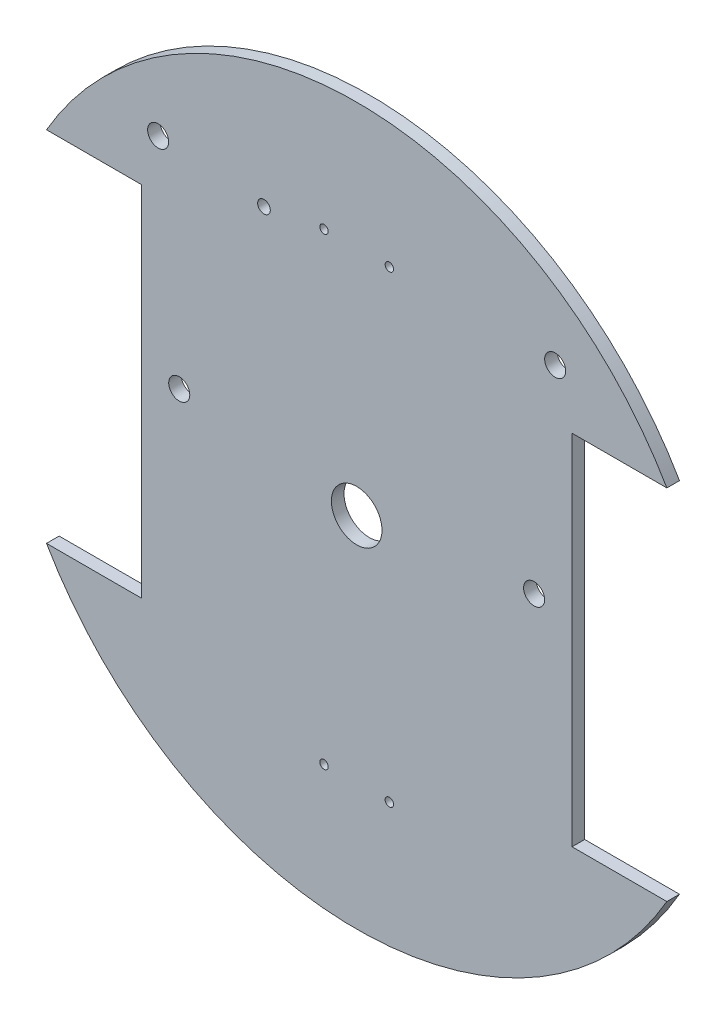
ISO-10303-21;
HEADER;
FILE_DESCRIPTION(('STEP AP214'),'2;1');
FILE_NAME('part.step','',(''),(''),'','','');
FILE_SCHEMA(('AUTOMOTIVE_DESIGN { 1 0 10303 214 1 1 1 1 }'));
ENDSEC;
DATA;
#1=APPLICATION_CONTEXT('core data for automotive mechanical design processes');
#2=APPLICATION_PROTOCOL_DEFINITION('international standard','automotive_design',2000,#1);
#3=PRODUCT_CONTEXT('',#1,'mechanical');
#4=PRODUCT('Part','Part','',(#3));
#5=PRODUCT_RELATED_PRODUCT_CATEGORY('part','',(#4));
#6=PRODUCT_DEFINITION_FORMATION('','',#4);
#7=PRODUCT_DEFINITION_CONTEXT('part definition',#1,'design');
#8=PRODUCT_DEFINITION('design','',#6,#7);
#9=PRODUCT_DEFINITION_SHAPE('','',#8);
#10=(LENGTH_UNIT() NAMED_UNIT(*) SI_UNIT(.MILLI.,.METRE.));
#11=(NAMED_UNIT(*) PLANE_ANGLE_UNIT() SI_UNIT($,.RADIAN.));
#12=(NAMED_UNIT(*) SI_UNIT($,.STERADIAN.) SOLID_ANGLE_UNIT());
#13=UNCERTAINTY_MEASURE_WITH_UNIT(LENGTH_MEASURE(1.E-05),#10,'distance_accuracy_value','');
#14=(GEOMETRIC_REPRESENTATION_CONTEXT(3) GLOBAL_UNCERTAINTY_ASSIGNED_CONTEXT((#13)) GLOBAL_UNIT_ASSIGNED_CONTEXT((#10,
#11,#12)) REPRESENTATION_CONTEXT('',''));
#15=CARTESIAN_POINT('',(0.,0.,0.));
#16=DIRECTION('',(0.,0.,1.));
#17=DIRECTION('',(1.,0.,0.));
#18=AXIS2_PLACEMENT_3D('',#15,#16,#17);
#19=CARTESIAN_POINT('',(-147.959743570363,62.548931244192,3.));
#20=DIRECTION('',(0.,0.,1.));
#21=DIRECTION('',(1.,0.,0.));
#22=AXIS2_PLACEMENT_3D('',#19,#20,#21);
#23=PLANE('',#22);
#24=CARTESIAN_POINT('',(-147.959743570363,62.548931244192,3.));
#25=DIRECTION('',(0.,0.,1.));
#26=DIRECTION('',(1.,0.,0.));
#27=AXIS2_PLACEMENT_3D('',#24,#25,#26);
#28=CIRCLE('',#27,6.00000000000002);
#29=CARTESIAN_POINT('',(-141.959743570363,62.548931244192,3.));
#30=VERTEX_POINT('',#29);
#31=EDGE_CURVE('E356',#30,#30,#28,.T.);
#32=ORIENTED_EDGE('',*,*,#31,.F.);
#33=EDGE_LOOP('',(#32));
#34=FACE_BOUND('',#33,.T.);
#35=CARTESIAN_POINT('',(-169.959743570363,115.048931244192,3.));
#36=DIRECTION('',(0.,0.,1.));
#37=DIRECTION('',(1.,0.,0.));
#38=AXIS2_PLACEMENT_3D('',#35,#36,#37);
#39=CIRCLE('',#38,1.5);
#40=CARTESIAN_POINT('',(-168.459743570363,115.048931244192,3.));
#41=VERTEX_POINT('',#40);
#42=EDGE_CURVE('E366',#41,#41,#39,.T.);
#43=ORIENTED_EDGE('',*,*,#42,.F.);
#44=EDGE_LOOP('',(#43));
#45=FACE_BOUND('',#44,.T.);
#46=CARTESIAN_POINT('',(-195.07190289204,117.048931244192,3.));
#47=DIRECTION('',(0.,0.,1.));
#48=DIRECTION('',(1.,0.,0.));
#49=AXIS2_PLACEMENT_3D('',#46,#47,#48);
#50=CIRCLE('',#49,2.5);
#51=CARTESIAN_POINT('',(-192.57190289204,117.048931244192,3.));
#52=VERTEX_POINT('',#51);
#53=EDGE_CURVE('E378',#52,#52,#50,.T.);
#54=ORIENTED_EDGE('',*,*,#53,.F.);
#55=EDGE_LOOP('',(#54));
#56=FACE_BOUND('',#55,.T.);
#57=CARTESIAN_POINT('',(-100.847584248685,117.048931244192,3.));
#58=DIRECTION('',(0.,0.,1.));
#59=DIRECTION('',(1.,0.,0.));
#60=AXIS2_PLACEMENT_3D('',#57,#58,#59);
#61=CIRCLE('',#60,2.50000000000001);
#62=CARTESIAN_POINT('',(-98.3475842486854,117.048931244192,3.));
#63=VERTEX_POINT('',#62);
#64=EDGE_CURVE('E373',#63,#63,#61,.T.);
#65=ORIENTED_EDGE('',*,*,#64,.F.);
#66=EDGE_LOOP('',(#65));
#67=FACE_BOUND('',#66,.T.);
#68=CARTESIAN_POINT('',(-190.07190289204,67.548931244192,3.));
#69=DIRECTION('',(0.,0.,1.));
#70=DIRECTION('',(1.,0.,0.));
#71=AXIS2_PLACEMENT_3D('',#68,#69,#70);
#72=CIRCLE('',#71,2.5);
#73=CARTESIAN_POINT('',(-187.57190289204,67.548931244192,3.));
#74=VERTEX_POINT('',#73);
#75=EDGE_CURVE('E390',#74,#74,#72,.T.);
#76=ORIENTED_EDGE('',*,*,#75,.F.);
#77=EDGE_LOOP('',(#76));
#78=FACE_BOUND('',#77,.T.);
#79=CARTESIAN_POINT('',(-105.847584248685,67.548931244192,3.));
#80=DIRECTION('',(0.,0.,1.));
#81=DIRECTION('',(1.,0.,0.));
#82=AXIS2_PLACEMENT_3D('',#79,#80,#81);
#83=CIRCLE('',#82,2.50000000000001);
#84=CARTESIAN_POINT('',(-103.347584248685,67.548931244192,3.));
#85=VERTEX_POINT('',#84);
#86=EDGE_CURVE('E385',#85,#85,#83,.T.);
#87=ORIENTED_EDGE('',*,*,#86,.F.);
#88=EDGE_LOOP('',(#87));
#89=FACE_BOUND('',#88,.T.);
#90=CARTESIAN_POINT('',(-155.709743570363,7.54893124419204,3.));
#91=DIRECTION('',(0.,0.,-1.));
#92=DIRECTION('',(-1.,0.,0.));
#93=AXIS2_PLACEMENT_3D('',#90,#91,#92);
#94=CIRCLE('',#93,0.999999999999998);
#95=CARTESIAN_POINT('',(-156.709743570363,7.54893124419204,3.));
#96=VERTEX_POINT('',#95);
#97=EDGE_CURVE('E396',#96,#96,#94,.T.);
#98=ORIENTED_EDGE('',*,*,#97,.T.);
#99=EDGE_LOOP('',(#98));
#100=FACE_BOUND('',#99,.T.);
#101=CARTESIAN_POINT('',(-140.209743570363,7.54893124419204,3.));
#102=DIRECTION('',(0.,0.,1.));
#103=DIRECTION('',(1.,0.,0.));
#104=AXIS2_PLACEMENT_3D('',#101,#102,#103);
#105=CIRCLE('',#104,0.999999999999998);
#106=CARTESIAN_POINT('',(-139.209743570363,7.54893124419204,3.));
#107=VERTEX_POINT('',#106);
#108=EDGE_CURVE('E393',#107,#107,#105,.T.);
#109=ORIENTED_EDGE('',*,*,#108,.F.);
#110=EDGE_LOOP('',(#109));
#111=FACE_BOUND('',#110,.T.);
#112=CARTESIAN_POINT('',(-155.709743570363,117.548931244192,3.));
#113=DIRECTION('',(0.,0.,1.));
#114=DIRECTION('',(1.,0.,0.));
#115=AXIS2_PLACEMENT_3D('',#112,#113,#114);
#116=CIRCLE('',#115,0.999999999999998);
#117=CARTESIAN_POINT('',(-154.709743570363,117.548931244192,3.));
#118=VERTEX_POINT('',#117);
#119=EDGE_CURVE('E137',#118,#118,#116,.T.);
#120=ORIENTED_EDGE('',*,*,#119,.F.);
#121=EDGE_LOOP('',(#120));
#122=FACE_BOUND('',#121,.T.);
#123=DIRECTION('',(0.,1.,0.));
#124=VECTOR('',#123,1.);
#125=CARTESIAN_POINT('',(-199.07190289204,62.548931244192,3.));
#126=LINE('',#125,#124);
#127=CARTESIAN_POINT('',(-199.07190289204,20.048931244192,3.));
#128=VERTEX_POINT('',#127);
#129=CARTESIAN_POINT('',(-199.07190289204,105.048931244192,3.));
#130=VERTEX_POINT('',#129);
#131=EDGE_CURVE('E110',#128,#130,#126,.T.);
#132=ORIENTED_EDGE('',*,*,#131,.F.);
#133=DIRECTION('',(-1.,0.,0.));
#134=VECTOR('',#133,1.);
#135=CARTESIAN_POINT('',(-147.959743570363,20.048931244192,3.));
#136=LINE('',#135,#134);
#137=CARTESIAN_POINT('',(-221.57190289204,20.048931244192,3.));
#138=VERTEX_POINT('',#137);
#139=EDGE_CURVE('E162',#128,#138,#136,.T.);
#140=ORIENTED_EDGE('',*,*,#139,.T.);
#141=CARTESIAN_POINT('',(-147.959743570363,62.548931244192,3.));
#142=DIRECTION('',(0.,0.,1.));
#143=DIRECTION('',(1.,0.,0.));
#144=AXIS2_PLACEMENT_3D('',#141,#142,#143);
#145=CIRCLE('',#144,85.);
#146=CARTESIAN_POINT('',(-74.3475842486854,20.048931244192,3.));
#147=VERTEX_POINT('',#146);
#148=EDGE_CURVE('E42',#138,#147,#145,.T.);
#149=ORIENTED_EDGE('',*,*,#148,.T.);
#150=DIRECTION('',(1.,0.,0.));
#151=VECTOR('',#150,1.);
#152=CARTESIAN_POINT('',(-147.959743570363,20.0489312441919,3.));
#153=LINE('',#152,#151);
#154=CARTESIAN_POINT('',(-96.8475842486854,20.048931244192,3.));
#155=VERTEX_POINT('',#154);
#156=EDGE_CURVE('E144',#155,#147,#153,.T.);
#157=ORIENTED_EDGE('',*,*,#156,.F.);
#158=DIRECTION('',(0.,1.,0.));
#159=VECTOR('',#158,1.);
#160=CARTESIAN_POINT('',(-96.8475842486854,62.548931244192,3.));
#161=LINE('',#160,#159);
#162=CARTESIAN_POINT('',(-96.8475842486854,105.048931244192,3.));
#163=VERTEX_POINT('',#162);
#164=EDGE_CURVE('E152',#155,#163,#161,.T.);
#165=ORIENTED_EDGE('',*,*,#164,.T.);
#166=DIRECTION('',(1.,0.,0.));
#167=VECTOR('',#166,1.);
#168=CARTESIAN_POINT('',(-147.959743570363,105.048931244192,3.));
#169=LINE('',#168,#167);
#170=CARTESIAN_POINT('',(-74.3475842486854,105.048931244192,3.));
#171=VERTEX_POINT('',#170);
#172=EDGE_CURVE('E147',#163,#171,#169,.T.);
#173=ORIENTED_EDGE('',*,*,#172,.T.);
#174=CARTESIAN_POINT('',(-221.57190289204,105.048931244192,3.));
#175=VERTEX_POINT('',#174);
#176=EDGE_CURVE('E11',#171,#175,#145,.T.);
#177=ORIENTED_EDGE('',*,*,#176,.T.);
#178=DIRECTION('',(-1.,0.,0.));
#179=VECTOR('',#178,1.);
#180=CARTESIAN_POINT('',(-147.959743570363,105.048931244192,3.));
#181=LINE('',#180,#179);
#182=EDGE_CURVE('E191',#130,#175,#181,.T.);
#183=ORIENTED_EDGE('',*,*,#182,.F.);
#184=EDGE_LOOP('',(#132,#140,#149,#157,#165,#173,#177,#183));
#185=FACE_BOUND('',#184,.T.);
#186=CARTESIAN_POINT('',(-140.209743570363,117.548931244192,3.));
#187=DIRECTION('',(0.,0.,-1.));
#188=DIRECTION('',(-1.,0.,0.));
#189=AXIS2_PLACEMENT_3D('',#186,#187,#188);
#190=CIRCLE('',#189,0.999999999999998);
#191=CARTESIAN_POINT('',(-141.209743570363,117.548931244192,3.));
#192=VERTEX_POINT('',#191);
#193=EDGE_CURVE('E397',#192,#192,#190,.T.);
#194=ORIENTED_EDGE('',*,*,#193,.T.);
#195=EDGE_LOOP('',(#194));
#196=FACE_BOUND('',#195,.T.);
#197=ADVANCED_FACE('F33',(#34,#45,#56,#67,#78,#89,#100,#111,#122,#185,#196),#23,.T.);
#198=CARTESIAN_POINT('',(-147.959743570363,62.548931244192,0.));
#199=DIRECTION('',(0.,0.,1.));
#200=DIRECTION('',(1.,0.,0.));
#201=AXIS2_PLACEMENT_3D('',#198,#199,#200);
#202=PLANE('',#201);
#203=CARTESIAN_POINT('',(-147.959743570363,62.548931244192,0.));
#204=DIRECTION('',(0.,0.,-1.));
#205=DIRECTION('',(-1.,0.,0.));
#206=AXIS2_PLACEMENT_3D('',#203,#204,#205);
#207=CIRCLE('',#206,6.00000000000002);
#208=CARTESIAN_POINT('',(-153.959743570363,62.548931244192,0.));
#209=VERTEX_POINT('',#208);
#210=EDGE_CURVE('E359',#209,#209,#207,.T.);
#211=ORIENTED_EDGE('',*,*,#210,.F.);
#212=EDGE_LOOP('',(#211));
#213=FACE_BOUND('',#212,.T.);
#214=CARTESIAN_POINT('',(-169.959743570363,115.048931244192,0.));
#215=DIRECTION('',(0.,0.,-1.));
#216=DIRECTION('',(-1.,0.,0.));
#217=AXIS2_PLACEMENT_3D('',#214,#215,#216);
#218=CIRCLE('',#217,1.5);
#219=CARTESIAN_POINT('',(-171.459743570363,115.048931244192,0.));
#220=VERTEX_POINT('',#219);
#221=EDGE_CURVE('E361',#220,#220,#218,.T.);
#222=ORIENTED_EDGE('',*,*,#221,.F.);
#223=EDGE_LOOP('',(#222));
#224=FACE_BOUND('',#223,.T.);
#225=CARTESIAN_POINT('',(-195.07190289204,117.048931244192,0.));
#226=DIRECTION('',(0.,0.,-1.));
#227=DIRECTION('',(-1.,0.,0.));
#228=AXIS2_PLACEMENT_3D('',#225,#226,#227);
#229=CIRCLE('',#228,2.5);
#230=CARTESIAN_POINT('',(-197.57190289204,117.048931244192,0.));
#231=VERTEX_POINT('',#230);
#232=EDGE_CURVE('E370',#231,#231,#229,.T.);
#233=ORIENTED_EDGE('',*,*,#232,.F.);
#234=EDGE_LOOP('',(#233));
#235=FACE_BOUND('',#234,.T.);
#236=CARTESIAN_POINT('',(-100.847584248685,117.048931244192,0.));
#237=DIRECTION('',(0.,0.,-1.));
#238=DIRECTION('',(1.,0.,0.));
#239=AXIS2_PLACEMENT_3D('',#236,#237,#238);
#240=CIRCLE('',#239,2.50000000000001);
#241=CARTESIAN_POINT('',(-98.3475842486854,117.048931244192,0.));
#242=VERTEX_POINT('',#241);
#243=EDGE_CURVE('E369',#242,#242,#240,.T.);
#244=ORIENTED_EDGE('',*,*,#243,.F.);
#245=EDGE_LOOP('',(#244));
#246=FACE_BOUND('',#245,.T.);
#247=CARTESIAN_POINT('',(-190.07190289204,67.548931244192,0.));
#248=DIRECTION('',(0.,0.,-1.));
#249=DIRECTION('',(-1.,0.,0.));
#250=AXIS2_PLACEMENT_3D('',#247,#248,#249);
#251=CIRCLE('',#250,2.5);
#252=CARTESIAN_POINT('',(-192.57190289204,67.548931244192,0.));
#253=VERTEX_POINT('',#252);
#254=EDGE_CURVE('E382',#253,#253,#251,.T.);
#255=ORIENTED_EDGE('',*,*,#254,.F.);
#256=EDGE_LOOP('',(#255));
#257=FACE_BOUND('',#256,.T.);
#258=CARTESIAN_POINT('',(-105.847584248685,67.548931244192,0.));
#259=DIRECTION('',(0.,0.,-1.));
#260=DIRECTION('',(-1.,0.,0.));
#261=AXIS2_PLACEMENT_3D('',#258,#259,#260);
#262=CIRCLE('',#261,2.50000000000001);
#263=CARTESIAN_POINT('',(-108.347584248685,67.548931244192,0.));
#264=VERTEX_POINT('',#263);
#265=EDGE_CURVE('E381',#264,#264,#262,.T.);
#266=ORIENTED_EDGE('',*,*,#265,.F.);
#267=EDGE_LOOP('',(#266));
#268=FACE_BOUND('',#267,.T.);
#269=CARTESIAN_POINT('',(-140.209743570363,7.54893124419204,0.));
#270=DIRECTION('',(0.,0.,1.));
#271=DIRECTION('',(1.,0.,0.));
#272=AXIS2_PLACEMENT_3D('',#269,#270,#271);
#273=CIRCLE('',#272,0.999999999999998);
#274=CARTESIAN_POINT('',(-139.209743570363,7.54893124419204,0.));
#275=VERTEX_POINT('',#274);
#276=EDGE_CURVE('E136',#275,#275,#273,.T.);
#277=ORIENTED_EDGE('',*,*,#276,.T.);
#278=EDGE_LOOP('',(#277));
#279=FACE_BOUND('',#278,.T.);
#280=CARTESIAN_POINT('',(-155.709743570363,117.548931244192,0.));
#281=DIRECTION('',(0.,0.,1.));
#282=DIRECTION('',(1.,0.,0.));
#283=AXIS2_PLACEMENT_3D('',#280,#281,#282);
#284=CIRCLE('',#283,0.999999999999998);
#285=CARTESIAN_POINT('',(-154.709743570363,117.548931244192,0.));
#286=VERTEX_POINT('',#285);
#287=EDGE_CURVE('E133',#286,#286,#284,.T.);
#288=ORIENTED_EDGE('',*,*,#287,.T.);
#289=EDGE_LOOP('',(#288));
#290=FACE_BOUND('',#289,.T.);
#291=DIRECTION('',(-1.,0.,0.));
#292=VECTOR('',#291,1.);
#293=CARTESIAN_POINT('',(-147.959743570363,20.048931244192,0.));
#294=LINE('',#293,#292);
#295=CARTESIAN_POINT('',(-199.07190289204,20.048931244192,0.));
#296=VERTEX_POINT('',#295);
#297=CARTESIAN_POINT('',(-221.57190289204,20.048931244192,0.));
#298=VERTEX_POINT('',#297);
#299=EDGE_CURVE('E99',#296,#298,#294,.T.);
#300=ORIENTED_EDGE('',*,*,#299,.F.);
#301=DIRECTION('',(0.,1.,0.));
#302=VECTOR('',#301,1.);
#303=CARTESIAN_POINT('',(-199.07190289204,62.548931244192,0.));
#304=LINE('',#303,#302);
#305=CARTESIAN_POINT('',(-199.07190289204,105.048931244192,0.));
#306=VERTEX_POINT('',#305);
#307=EDGE_CURVE('E185',#296,#306,#304,.T.);
#308=ORIENTED_EDGE('',*,*,#307,.T.);
#309=DIRECTION('',(-1.,0.,0.));
#310=VECTOR('',#309,1.);
#311=CARTESIAN_POINT('',(-147.959743570363,105.048931244192,0.));
#312=LINE('',#311,#310);
#313=CARTESIAN_POINT('',(-221.57190289204,105.048931244192,0.));
#314=VERTEX_POINT('',#313);
#315=EDGE_CURVE('E50',#306,#314,#312,.T.);
#316=ORIENTED_EDGE('',*,*,#315,.T.);
#317=CARTESIAN_POINT('',(-147.959743570363,62.548931244192,0.));
#318=DIRECTION('',(0.,0.,1.));
#319=DIRECTION('',(1.,0.,0.));
#320=AXIS2_PLACEMENT_3D('',#317,#318,#319);
#321=CIRCLE('',#320,85.);
#322=CARTESIAN_POINT('',(-74.3475842486854,105.048931244192,0.));
#323=VERTEX_POINT('',#322);
#324=EDGE_CURVE('E127',#323,#314,#321,.T.);
#325=ORIENTED_EDGE('',*,*,#324,.F.);
#326=DIRECTION('',(1.,0.,0.));
#327=VECTOR('',#326,1.);
#328=CARTESIAN_POINT('',(-147.959743570363,105.048931244192,0.));
#329=LINE('',#328,#327);
#330=CARTESIAN_POINT('',(-96.8475842486854,105.048931244192,0.));
#331=VERTEX_POINT('',#330);
#332=EDGE_CURVE('E167',#331,#323,#329,.T.);
#333=ORIENTED_EDGE('',*,*,#332,.F.);
#334=DIRECTION('',(0.,1.,0.));
#335=VECTOR('',#334,1.);
#336=CARTESIAN_POINT('',(-96.8475842486854,62.548931244192,0.));
#337=LINE('',#336,#335);
#338=CARTESIAN_POINT('',(-96.8475842486854,20.048931244192,0.));
#339=VERTEX_POINT('',#338);
#340=EDGE_CURVE('E155',#339,#331,#337,.T.);
#341=ORIENTED_EDGE('',*,*,#340,.F.);
#342=DIRECTION('',(1.,0.,0.));
#343=VECTOR('',#342,1.);
#344=CARTESIAN_POINT('',(-147.959743570363,20.0489312441919,0.));
#345=LINE('',#344,#343);
#346=CARTESIAN_POINT('',(-74.3475842486854,20.048931244192,0.));
#347=VERTEX_POINT('',#346);
#348=EDGE_CURVE('E126',#339,#347,#345,.T.);
#349=ORIENTED_EDGE('',*,*,#348,.T.);
#350=EDGE_CURVE('E116',#298,#347,#321,.T.);
#351=ORIENTED_EDGE('',*,*,#350,.F.);
#352=EDGE_LOOP('',(#300,#308,#316,#325,#333,#341,#349,#351));
#353=FACE_BOUND('',#352,.T.);
#354=CARTESIAN_POINT('',(-155.709743570363,7.54893124419204,0.));
#355=DIRECTION('',(0.,0.,1.));
#356=DIRECTION('',(1.,0.,0.));
#357=AXIS2_PLACEMENT_3D('',#354,#355,#356);
#358=CIRCLE('',#357,0.999999999999998);
#359=CARTESIAN_POINT('',(-154.709743570363,7.54893124419204,0.));
#360=VERTEX_POINT('',#359);
#361=EDGE_CURVE('E139',#360,#360,#358,.F.);
#362=ORIENTED_EDGE('',*,*,#361,.F.);
#363=EDGE_LOOP('',(#362));
#364=FACE_BOUND('',#363,.T.);
#365=CARTESIAN_POINT('',(-140.209743570363,117.548931244192,0.));
#366=DIRECTION('',(0.,0.,1.));
#367=DIRECTION('',(1.,0.,0.));
#368=AXIS2_PLACEMENT_3D('',#365,#366,#367);
#369=CIRCLE('',#368,0.999999999999998);
#370=CARTESIAN_POINT('',(-139.209743570363,117.548931244192,0.));
#371=VERTEX_POINT('',#370);
#372=EDGE_CURVE('E37',#371,#371,#369,.F.);
#373=ORIENTED_EDGE('',*,*,#372,.F.);
#374=EDGE_LOOP('',(#373));
#375=FACE_BOUND('',#374,.T.);
#376=ADVANCED_FACE('F122',(#213,#224,#235,#246,#257,#268,#279,#290,#353,#364,#375),#202,.F.);
#377=CARTESIAN_POINT('',(-147.959743570363,62.548931244192,3.));
#378=DIRECTION('',(0.,0.,-1.));
#379=DIRECTION('',(-1.,0.,0.));
#380=AXIS2_PLACEMENT_3D('',#377,#378,#379);
#381=CYLINDRICAL_SURFACE('',#380,85.);
#382=ORIENTED_EDGE('',*,*,#324,.T.);
#383=DIRECTION('',(0.,0.,1.));
#384=VECTOR('',#383,1.);
#385=CARTESIAN_POINT('',(-221.57190289204,105.048931244192,0.));
#386=LINE('',#385,#384);
#387=EDGE_CURVE('E119',#314,#175,#386,.T.);
#388=ORIENTED_EDGE('',*,*,#387,.T.);
#389=ORIENTED_EDGE('',*,*,#176,.F.);
#390=DIRECTION('',(0.,0.,-1.));
#391=VECTOR('',#390,1.);
#392=CARTESIAN_POINT('',(-74.3475842486854,105.048931244192,3.));
#393=LINE('',#392,#391);
#394=EDGE_CURVE('E118',#323,#171,#393,.F.);
#395=ORIENTED_EDGE('',*,*,#394,.F.);
#396=EDGE_LOOP('',(#382,#388,#389,#395));
#397=FACE_BOUND('',#396,.T.);
#398=ADVANCED_FACE('F177',(#397),#381,.T.);
#399=DIRECTION('',(0.,0.,1.));
#400=VECTOR('',#399,1.);
#401=CARTESIAN_POINT('',(-221.57190289204,20.048931244192,0.));
#402=LINE('',#401,#400);
#403=EDGE_CURVE('E103',#298,#138,#402,.T.);
#404=ORIENTED_EDGE('',*,*,#403,.F.);
#405=ORIENTED_EDGE('',*,*,#350,.T.);
#406=DIRECTION('',(0.,0.,-1.));
#407=VECTOR('',#406,1.);
#408=CARTESIAN_POINT('',(-74.3475842486854,20.048931244192,3.));
#409=LINE('',#408,#407);
#410=EDGE_CURVE('E128',#347,#147,#409,.F.);
#411=ORIENTED_EDGE('',*,*,#410,.T.);
#412=ORIENTED_EDGE('',*,*,#148,.F.);
#413=EDGE_LOOP('',(#404,#405,#411,#412));
#414=FACE_BOUND('',#413,.T.);
#415=ADVANCED_FACE('F35',(#414),#381,.T.);
#416=CARTESIAN_POINT('',(-147.959743570363,20.0489312441919,0.));
#417=DIRECTION('',(0.,-1.,0.));
#418=DIRECTION('',(1.,0.,0.));
#419=AXIS2_PLACEMENT_3D('',#416,#417,#418);
#420=PLANE('',#419);
#421=ORIENTED_EDGE('',*,*,#348,.F.);
#422=DIRECTION('',(0.,0.,1.));
#423=VECTOR('',#422,1.);
#424=CARTESIAN_POINT('',(-96.8475842486854,20.048931244192,0.));
#425=LINE('',#424,#423);
#426=EDGE_CURVE('E160',#339,#155,#425,.T.);
#427=ORIENTED_EDGE('',*,*,#426,.T.);
#428=ORIENTED_EDGE('',*,*,#156,.T.);
#429=ORIENTED_EDGE('',*,*,#410,.F.);
#430=EDGE_LOOP('',(#421,#427,#428,#429));
#431=FACE_BOUND('',#430,.T.);
#432=ADVANCED_FACE('F216',(#431),#420,.F.);
#433=CARTESIAN_POINT('',(-147.959743570363,105.048931244192,0.));
#434=DIRECTION('',(0.,-1.,0.));
#435=DIRECTION('',(0.,0.,-1.));
#436=AXIS2_PLACEMENT_3D('',#433,#434,#435);
#437=PLANE('',#436);
#438=ORIENTED_EDGE('',*,*,#394,.T.);
#439=ORIENTED_EDGE('',*,*,#172,.F.);
#440=DIRECTION('',(0.,0.,1.));
#441=VECTOR('',#440,1.);
#442=CARTESIAN_POINT('',(-96.8475842486854,105.048931244192,0.));
#443=LINE('',#442,#441);
#444=EDGE_CURVE('E58',#331,#163,#443,.T.);
#445=ORIENTED_EDGE('',*,*,#444,.F.);
#446=ORIENTED_EDGE('',*,*,#332,.T.);
#447=EDGE_LOOP('',(#438,#439,#445,#446));
#448=FACE_BOUND('',#447,.T.);
#449=ADVANCED_FACE('F165',(#448),#437,.T.);
#450=CARTESIAN_POINT('',(-96.8475842486854,62.548931244192,0.));
#451=DIRECTION('',(1.,0.,0.));
#452=DIRECTION('',(0.,1.,0.));
#453=AXIS2_PLACEMENT_3D('',#450,#451,#452);
#454=PLANE('',#453);
#455=ORIENTED_EDGE('',*,*,#164,.F.);
#456=ORIENTED_EDGE('',*,*,#426,.F.);
#457=ORIENTED_EDGE('',*,*,#340,.T.);
#458=ORIENTED_EDGE('',*,*,#444,.T.);
#459=EDGE_LOOP('',(#455,#456,#457,#458));
#460=FACE_BOUND('',#459,.T.);
#461=ADVANCED_FACE('F184',(#460),#454,.T.);
#462=CARTESIAN_POINT('',(-199.07190289204,62.548931244192,0.));
#463=DIRECTION('',(1.,0.,0.));
#464=DIRECTION('',(0.,1.,0.));
#465=AXIS2_PLACEMENT_3D('',#462,#463,#464);
#466=PLANE('',#465);
#467=ORIENTED_EDGE('',*,*,#131,.T.);
#468=DIRECTION('',(0.,0.,1.));
#469=VECTOR('',#468,1.);
#470=CARTESIAN_POINT('',(-199.07190289204,105.048931244192,0.));
#471=LINE('',#470,#469);
#472=EDGE_CURVE('E178',#306,#130,#471,.T.);
#473=ORIENTED_EDGE('',*,*,#472,.F.);
#474=ORIENTED_EDGE('',*,*,#307,.F.);
#475=DIRECTION('',(0.,0.,1.));
#476=VECTOR('',#475,1.);
#477=CARTESIAN_POINT('',(-199.07190289204,20.048931244192,0.));
#478=LINE('',#477,#476);
#479=EDGE_CURVE('E105',#296,#128,#478,.T.);
#480=ORIENTED_EDGE('',*,*,#479,.T.);
#481=EDGE_LOOP('',(#467,#473,#474,#480));
#482=FACE_BOUND('',#481,.T.);
#483=ADVANCED_FACE('F195',(#482),#466,.F.);
#484=CARTESIAN_POINT('',(-147.959743570363,105.048931244192,0.));
#485=DIRECTION('',(0.,1.,0.));
#486=DIRECTION('',(-1.,0.,0.));
#487=AXIS2_PLACEMENT_3D('',#484,#485,#486);
#488=PLANE('',#487);
#489=ORIENTED_EDGE('',*,*,#182,.T.);
#490=ORIENTED_EDGE('',*,*,#387,.F.);
#491=ORIENTED_EDGE('',*,*,#315,.F.);
#492=ORIENTED_EDGE('',*,*,#472,.T.);
#493=EDGE_LOOP('',(#489,#490,#491,#492));
#494=FACE_BOUND('',#493,.T.);
#495=ADVANCED_FACE('F196',(#494),#488,.F.);
#496=CARTESIAN_POINT('',(-147.959743570363,20.048931244192,0.));
#497=DIRECTION('',(0.,1.,0.));
#498=DIRECTION('',(-1.,0.,0.));
#499=AXIS2_PLACEMENT_3D('',#496,#497,#498);
#500=PLANE('',#499);
#501=ORIENTED_EDGE('',*,*,#139,.F.);
#502=ORIENTED_EDGE('',*,*,#479,.F.);
#503=ORIENTED_EDGE('',*,*,#299,.T.);
#504=ORIENTED_EDGE('',*,*,#403,.T.);
#505=EDGE_LOOP('',(#501,#502,#503,#504));
#506=FACE_BOUND('',#505,.T.);
#507=ADVANCED_FACE('F102',(#506),#500,.T.);
#508=CARTESIAN_POINT('',(-155.709743570363,117.548931244192,-7.));
#509=DIRECTION('',(0.,0.,1.));
#510=DIRECTION('',(1.,0.,0.));
#511=AXIS2_PLACEMENT_3D('',#508,#509,#510);
#512=CYLINDRICAL_SURFACE('',#511,0.999999999999998);
#513=ORIENTED_EDGE('',*,*,#119,.T.);
#514=EDGE_LOOP('',(#513));
#515=FACE_BOUND('',#514,.T.);
#516=ORIENTED_EDGE('',*,*,#287,.F.);
#517=EDGE_LOOP('',(#516));
#518=FACE_BOUND('',#517,.T.);
#519=ADVANCED_FACE('F203',(#515,#518),#512,.F.);
#520=CARTESIAN_POINT('',(-140.209743570363,7.54893124419204,-7.));
#521=DIRECTION('',(0.,0.,1.));
#522=DIRECTION('',(1.,0.,0.));
#523=AXIS2_PLACEMENT_3D('',#520,#521,#522);
#524=CYLINDRICAL_SURFACE('',#523,0.999999999999998);
#525=ORIENTED_EDGE('',*,*,#108,.T.);
#526=EDGE_LOOP('',(#525));
#527=FACE_BOUND('',#526,.T.);
#528=ORIENTED_EDGE('',*,*,#276,.F.);
#529=EDGE_LOOP('',(#528));
#530=FACE_BOUND('',#529,.T.);
#531=ADVANCED_FACE('F250',(#527,#530),#524,.F.);
#532=CARTESIAN_POINT('',(-155.709743570363,7.54893124419204,-7.));
#533=DIRECTION('',(0.,0.,1.));
#534=DIRECTION('',(1.,0.,0.));
#535=AXIS2_PLACEMENT_3D('',#532,#533,#534);
#536=CYLINDRICAL_SURFACE('',#535,0.999999999999998);
#537=ORIENTED_EDGE('',*,*,#97,.F.);
#538=EDGE_LOOP('',(#537));
#539=FACE_BOUND('',#538,.T.);
#540=ORIENTED_EDGE('',*,*,#361,.T.);
#541=EDGE_LOOP('',(#540));
#542=FACE_BOUND('',#541,.T.);
#543=ADVANCED_FACE('F261',(#539,#542),#536,.F.);
#544=CARTESIAN_POINT('',(-140.209743570363,117.548931244192,-7.));
#545=DIRECTION('',(0.,0.,1.));
#546=DIRECTION('',(1.,0.,0.));
#547=AXIS2_PLACEMENT_3D('',#544,#545,#546);
#548=CYLINDRICAL_SURFACE('',#547,0.999999999999998);
#549=ORIENTED_EDGE('',*,*,#193,.F.);
#550=EDGE_LOOP('',(#549));
#551=FACE_BOUND('',#550,.T.);
#552=ORIENTED_EDGE('',*,*,#372,.T.);
#553=EDGE_LOOP('',(#552));
#554=FACE_BOUND('',#553,.T.);
#555=ADVANCED_FACE('F271',(#551,#554),#548,.F.);
#556=CARTESIAN_POINT('',(-105.847584248685,67.548931244192,10.));
#557=DIRECTION('',(0.,0.,-1.));
#558=DIRECTION('',(-1.,0.,0.));
#559=AXIS2_PLACEMENT_3D('',#556,#557,#558);
#560=CYLINDRICAL_SURFACE('',#559,2.50000000000001);
#561=ORIENTED_EDGE('',*,*,#86,.T.);
#562=EDGE_LOOP('',(#561));
#563=FACE_BOUND('',#562,.T.);
#564=ORIENTED_EDGE('',*,*,#265,.T.);
#565=EDGE_LOOP('',(#564));
#566=FACE_BOUND('',#565,.T.);
#567=ADVANCED_FACE('F281',(#563,#566),#560,.F.);
#568=CARTESIAN_POINT('',(-190.07190289204,67.548931244192,10.));
#569=DIRECTION('',(0.,0.,-1.));
#570=DIRECTION('',(-1.,0.,0.));
#571=AXIS2_PLACEMENT_3D('',#568,#569,#570);
#572=CYLINDRICAL_SURFACE('',#571,2.5);
#573=ORIENTED_EDGE('',*,*,#75,.T.);
#574=EDGE_LOOP('',(#573));
#575=FACE_BOUND('',#574,.T.);
#576=ORIENTED_EDGE('',*,*,#254,.T.);
#577=EDGE_LOOP('',(#576));
#578=FACE_BOUND('',#577,.T.);
#579=ADVANCED_FACE('F291',(#575,#578),#572,.F.);
#580=CARTESIAN_POINT('',(-100.847584248685,117.048931244192,10.));
#581=DIRECTION('',(0.,0.,-1.));
#582=DIRECTION('',(-1.,0.,0.));
#583=AXIS2_PLACEMENT_3D('',#580,#581,#582);
#584=CYLINDRICAL_SURFACE('',#583,2.50000000000001);
#585=ORIENTED_EDGE('',*,*,#64,.T.);
#586=EDGE_LOOP('',(#585));
#587=FACE_BOUND('',#586,.T.);
#588=ORIENTED_EDGE('',*,*,#243,.T.);
#589=EDGE_LOOP('',(#588));
#590=FACE_BOUND('',#589,.T.);
#591=ADVANCED_FACE('F301',(#587,#590),#584,.F.);
#592=CARTESIAN_POINT('',(-195.07190289204,117.048931244192,10.));
#593=DIRECTION('',(0.,0.,-1.));
#594=DIRECTION('',(-1.,0.,0.));
#595=AXIS2_PLACEMENT_3D('',#592,#593,#594);
#596=CYLINDRICAL_SURFACE('',#595,2.5);
#597=ORIENTED_EDGE('',*,*,#53,.T.);
#598=EDGE_LOOP('',(#597));
#599=FACE_BOUND('',#598,.T.);
#600=ORIENTED_EDGE('',*,*,#232,.T.);
#601=EDGE_LOOP('',(#600));
#602=FACE_BOUND('',#601,.T.);
#603=ADVANCED_FACE('F311',(#599,#602),#596,.F.);
#604=CARTESIAN_POINT('',(-169.959743570363,115.048931244192,10.));
#605=DIRECTION('',(0.,0.,-1.));
#606=DIRECTION('',(-1.,0.,0.));
#607=AXIS2_PLACEMENT_3D('',#604,#605,#606);
#608=CYLINDRICAL_SURFACE('',#607,1.5);
#609=ORIENTED_EDGE('',*,*,#42,.T.);
#610=EDGE_LOOP('',(#609));
#611=FACE_BOUND('',#610,.T.);
#612=ORIENTED_EDGE('',*,*,#221,.T.);
#613=EDGE_LOOP('',(#612));
#614=FACE_BOUND('',#613,.T.);
#615=ADVANCED_FACE('F321',(#611,#614),#608,.F.);
#616=CARTESIAN_POINT('',(-147.959743570363,62.548931244192,10.));
#617=DIRECTION('',(0.,0.,-1.));
#618=DIRECTION('',(-1.,0.,0.));
#619=AXIS2_PLACEMENT_3D('',#616,#617,#618);
#620=CYLINDRICAL_SURFACE('',#619,6.00000000000002);
#621=ORIENTED_EDGE('',*,*,#31,.T.);
#622=EDGE_LOOP('',(#621));
#623=FACE_BOUND('',#622,.T.);
#624=ORIENTED_EDGE('',*,*,#210,.T.);
#625=EDGE_LOOP('',(#624));
#626=FACE_BOUND('',#625,.T.);
#627=ADVANCED_FACE('F330',(#623,#626),#620,.F.);
#628=CLOSED_SHELL('',(#197,#376,#398,#415,#432,#449,#461,#483,#495,#507,#519,#531,#543,#555,
#567,#579,#591,#603,#615,#627));
#629=MANIFOLD_SOLID_BREP('B2',#628);
#630=ADVANCED_BREP_SHAPE_REPRESENTATION('',(#18,#629),#14);
#631=SHAPE_DEFINITION_REPRESENTATION(#9,#630);
ENDSEC;
END-ISO-10303-21;
